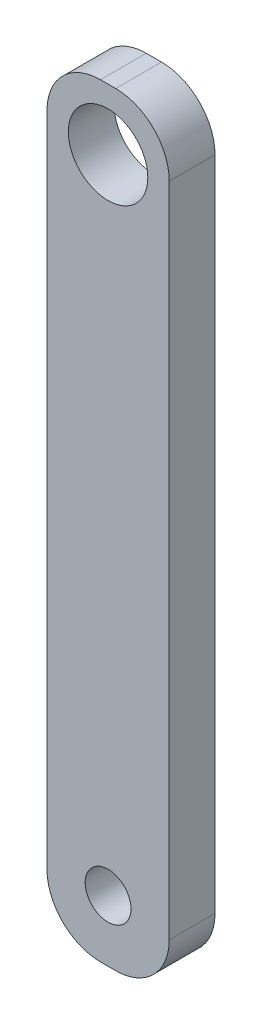
ISO-10303-21;
HEADER;
FILE_DESCRIPTION(('STEP AP214'),'2;1');
FILE_NAME('part.step','',(''),(''),'','','');
FILE_SCHEMA(('AUTOMOTIVE_DESIGN { 1 0 10303 214 1 1 1 1 }'));
ENDSEC;
DATA;
#1=APPLICATION_CONTEXT('core data for automotive mechanical design processes');
#2=APPLICATION_PROTOCOL_DEFINITION('international standard','automotive_design',2000,#1);
#3=PRODUCT_CONTEXT('',#1,'mechanical');
#4=PRODUCT('Part','Part','',(#3));
#5=PRODUCT_RELATED_PRODUCT_CATEGORY('part','',(#4));
#6=PRODUCT_DEFINITION_FORMATION('','',#4);
#7=PRODUCT_DEFINITION_CONTEXT('part definition',#1,'design');
#8=PRODUCT_DEFINITION('design','',#6,#7);
#9=PRODUCT_DEFINITION_SHAPE('','',#8);
#10=(LENGTH_UNIT() NAMED_UNIT(*) SI_UNIT(.MILLI.,.METRE.));
#11=(NAMED_UNIT(*) PLANE_ANGLE_UNIT() SI_UNIT($,.RADIAN.));
#12=(NAMED_UNIT(*) SI_UNIT($,.STERADIAN.) SOLID_ANGLE_UNIT());
#13=UNCERTAINTY_MEASURE_WITH_UNIT(LENGTH_MEASURE(1.E-05),#10,'distance_accuracy_value','');
#14=(GEOMETRIC_REPRESENTATION_CONTEXT(3) GLOBAL_UNCERTAINTY_ASSIGNED_CONTEXT((#13)) GLOBAL_UNIT_ASSIGNED_CONTEXT((#10,
#11,#12)) REPRESENTATION_CONTEXT('',''));
#15=CARTESIAN_POINT('',(0.,0.,0.));
#16=DIRECTION('',(0.,0.,1.));
#17=DIRECTION('',(1.,0.,0.));
#18=AXIS2_PLACEMENT_3D('',#15,#16,#17);
#19=CARTESIAN_POINT('',(-2.8,17.2528590218937,-2.55));
#20=DIRECTION('',(0.,1.,0.));
#21=DIRECTION('',(0.,0.,1.));
#22=AXIS2_PLACEMENT_3D('',#19,#20,#21);
#23=PLANE('',#22);
#24=DIRECTION('',(-1.,0.,0.));
#25=VECTOR('',#24,1.);
#26=CARTESIAN_POINT('',(-2.8,17.2528590218937,-0.45));
#27=LINE('',#26,#25);
#28=CARTESIAN_POINT('',(0.350000000000001,17.2528590218937,-0.45));
#29=VERTEX_POINT('',#28);
#30=CARTESIAN_POINT('',(-0.349999999999999,17.2528590218937,-0.45));
#31=VERTEX_POINT('',#30);
#32=EDGE_CURVE('E173',#29,#31,#27,.T.);
#33=ORIENTED_EDGE('',*,*,#32,.F.);
#34=DIRECTION('',(0.,0.,1.));
#35=VECTOR('',#34,1.);
#36=CARTESIAN_POINT('',(0.350000000000001,17.2528590218937,-2.55));
#37=LINE('',#36,#35);
#38=CARTESIAN_POINT('',(0.350000000000001,17.2528590218937,-2.55));
#39=VERTEX_POINT('',#38);
#40=EDGE_CURVE('E148',#29,#39,#37,.F.);
#41=ORIENTED_EDGE('',*,*,#40,.T.);
#42=DIRECTION('',(-1.,0.,0.));
#43=VECTOR('',#42,1.);
#44=CARTESIAN_POINT('',(-2.8,17.2528590218937,-2.55));
#45=LINE('',#44,#43);
#46=CARTESIAN_POINT('',(-0.349999999999999,17.2528590218937,-2.55));
#47=VERTEX_POINT('',#46);
#48=EDGE_CURVE('E129',#39,#47,#45,.T.);
#49=ORIENTED_EDGE('',*,*,#48,.T.);
#50=DIRECTION('',(0.,0.,1.));
#51=VECTOR('',#50,1.);
#52=CARTESIAN_POINT('',(-0.349999999999999,17.2528590218937,-2.55));
#53=LINE('',#52,#51);
#54=EDGE_CURVE('E145',#47,#31,#53,.T.);
#55=ORIENTED_EDGE('',*,*,#54,.T.);
#56=EDGE_LOOP('',(#33,#41,#49,#55));
#57=FACE_BOUND('',#56,.T.);
#58=ADVANCED_FACE('F42',(#57),#23,.T.);
#59=CARTESIAN_POINT('',(2.8,-17.7471409781063,-2.55));
#60=DIRECTION('',(1.,0.,0.));
#61=DIRECTION('',(0.,0.,-1.));
#62=AXIS2_PLACEMENT_3D('',#59,#60,#61);
#63=PLANE('',#62);
#64=DIRECTION('',(0.,1.,0.));
#65=VECTOR('',#64,1.);
#66=CARTESIAN_POINT('',(2.8,-17.7471409781063,-2.55));
#67=LINE('',#66,#65);
#68=CARTESIAN_POINT('',(2.8,-15.2971409781063,-2.55));
#69=VERTEX_POINT('',#68);
#70=CARTESIAN_POINT('',(2.8,14.8028590218937,-2.55));
#71=VERTEX_POINT('',#70);
#72=EDGE_CURVE('E134',#69,#71,#67,.T.);
#73=ORIENTED_EDGE('',*,*,#72,.T.);
#74=DIRECTION('',(0.,0.,1.));
#75=VECTOR('',#74,1.);
#76=CARTESIAN_POINT('',(2.8,14.8028590218937,-2.55));
#77=LINE('',#76,#75);
#78=CARTESIAN_POINT('',(2.8,14.8028590218937,-0.45));
#79=VERTEX_POINT('',#78);
#80=EDGE_CURVE('E128',#71,#79,#77,.T.);
#81=ORIENTED_EDGE('',*,*,#80,.T.);
#82=DIRECTION('',(0.,1.,0.));
#83=VECTOR('',#82,1.);
#84=CARTESIAN_POINT('',(2.8,-17.7471409781063,-0.45));
#85=LINE('',#84,#83);
#86=CARTESIAN_POINT('',(2.8,-15.2971409781063,-0.45));
#87=VERTEX_POINT('',#86);
#88=EDGE_CURVE('E112',#87,#79,#85,.T.);
#89=ORIENTED_EDGE('',*,*,#88,.F.);
#90=DIRECTION('',(0.,0.,1.));
#91=VECTOR('',#90,1.);
#92=CARTESIAN_POINT('',(2.8,-15.2971409781063,-2.55));
#93=LINE('',#92,#91);
#94=EDGE_CURVE('E125',#87,#69,#93,.F.);
#95=ORIENTED_EDGE('',*,*,#94,.T.);
#96=EDGE_LOOP('',(#73,#81,#89,#95));
#97=FACE_BOUND('',#96,.T.);
#98=ADVANCED_FACE('F124',(#97),#63,.T.);
#99=CARTESIAN_POINT('',(-2.8,-17.7471409781063,-2.55));
#100=DIRECTION('',(0.,-1.,0.));
#101=DIRECTION('',(0.,0.,-1.));
#102=AXIS2_PLACEMENT_3D('',#99,#100,#101);
#103=PLANE('',#102);
#104=DIRECTION('',(1.,0.,0.));
#105=VECTOR('',#104,1.);
#106=CARTESIAN_POINT('',(-2.8,-17.7471409781063,-2.55));
#107=LINE('',#106,#105);
#108=CARTESIAN_POINT('',(-0.349999999999999,-17.7471409781063,-2.55));
#109=VERTEX_POINT('',#108);
#110=CARTESIAN_POINT('',(0.350000000000001,-17.7471409781063,-2.55));
#111=VERTEX_POINT('',#110);
#112=EDGE_CURVE('E137',#109,#111,#107,.T.);
#113=ORIENTED_EDGE('',*,*,#112,.T.);
#114=DIRECTION('',(0.,0.,1.));
#115=VECTOR('',#114,1.);
#116=CARTESIAN_POINT('',(0.350000000000001,-17.7471409781063,-2.55));
#117=LINE('',#116,#115);
#118=CARTESIAN_POINT('',(0.350000000000001,-17.7471409781063,-0.45));
#119=VERTEX_POINT('',#118);
#120=EDGE_CURVE('E12',#111,#119,#117,.T.);
#121=ORIENTED_EDGE('',*,*,#120,.T.);
#122=DIRECTION('',(1.,0.,0.));
#123=VECTOR('',#122,1.);
#124=CARTESIAN_POINT('',(-2.8,-17.7471409781063,-0.45));
#125=LINE('',#124,#123);
#126=CARTESIAN_POINT('',(-0.349999999999999,-17.7471409781063,-0.45));
#127=VERTEX_POINT('',#126);
#128=EDGE_CURVE('E114',#127,#119,#125,.T.);
#129=ORIENTED_EDGE('',*,*,#128,.F.);
#130=DIRECTION('',(0.,0.,1.));
#131=VECTOR('',#130,1.);
#132=CARTESIAN_POINT('',(-0.349999999999999,-17.7471409781063,-2.55));
#133=LINE('',#132,#131);
#134=EDGE_CURVE('E50',#127,#109,#133,.F.);
#135=ORIENTED_EDGE('',*,*,#134,.T.);
#136=EDGE_LOOP('',(#113,#121,#129,#135));
#137=FACE_BOUND('',#136,.T.);
#138=ADVANCED_FACE('F162',(#137),#103,.T.);
#139=CARTESIAN_POINT('',(-2.8,-17.7471409781063,-2.55));
#140=DIRECTION('',(-1.,0.,0.));
#141=DIRECTION('',(0.,0.,1.));
#142=AXIS2_PLACEMENT_3D('',#139,#140,#141);
#143=PLANE('',#142);
#144=DIRECTION('',(0.,-1.,0.));
#145=VECTOR('',#144,1.);
#146=CARTESIAN_POINT('',(-2.8,-17.7471409781063,-0.45));
#147=LINE('',#146,#145);
#148=CARTESIAN_POINT('',(-2.8,14.8028590218937,-0.45));
#149=VERTEX_POINT('',#148);
#150=CARTESIAN_POINT('',(-2.8,-15.2971409781063,-0.45));
#151=VERTEX_POINT('',#150);
#152=EDGE_CURVE('E171',#149,#151,#147,.T.);
#153=ORIENTED_EDGE('',*,*,#152,.F.);
#154=DIRECTION('',(0.,0.,1.));
#155=VECTOR('',#154,1.);
#156=CARTESIAN_POINT('',(-2.8,14.8028590218937,-2.55));
#157=LINE('',#156,#155);
#158=CARTESIAN_POINT('',(-2.8,14.8028590218937,-2.55));
#159=VERTEX_POINT('',#158);
#160=EDGE_CURVE('E64',#149,#159,#157,.F.);
#161=ORIENTED_EDGE('',*,*,#160,.T.);
#162=DIRECTION('',(0.,-1.,0.));
#163=VECTOR('',#162,1.);
#164=CARTESIAN_POINT('',(-2.8,-17.7471409781063,-2.55));
#165=LINE('',#164,#163);
#166=CARTESIAN_POINT('',(-2.8,-15.2971409781063,-2.55));
#167=VERTEX_POINT('',#166);
#168=EDGE_CURVE('E166',#159,#167,#165,.T.);
#169=ORIENTED_EDGE('',*,*,#168,.T.);
#170=DIRECTION('',(0.,0.,1.));
#171=VECTOR('',#170,1.);
#172=CARTESIAN_POINT('',(-2.8,-15.2971409781063,-2.55));
#173=LINE('',#172,#171);
#174=EDGE_CURVE('E156',#167,#151,#173,.T.);
#175=ORIENTED_EDGE('',*,*,#174,.T.);
#176=EDGE_LOOP('',(#153,#161,#169,#175));
#177=FACE_BOUND('',#176,.T.);
#178=ADVANCED_FACE('F170',(#177),#143,.T.);
#179=CARTESIAN_POINT('',(0.,-0.247140978106257,-2.55));
#180=DIRECTION('',(0.,0.,1.));
#181=DIRECTION('',(1.,0.,0.));
#182=AXIS2_PLACEMENT_3D('',#179,#180,#181);
#183=PLANE('',#182);
#184=CARTESIAN_POINT('',(0.,14.4528590218937,-2.55));
#185=DIRECTION('',(0.,0.,1.));
#186=DIRECTION('',(1.,0.,0.));
#187=AXIS2_PLACEMENT_3D('',#184,#185,#186);
#188=CIRCLE('',#187,1.82);
#189=CARTESIAN_POINT('',(1.82,14.4528590218937,-2.55));
#190=VERTEX_POINT('',#189);
#191=EDGE_CURVE('E184',#190,#190,#188,.T.);
#192=ORIENTED_EDGE('',*,*,#191,.T.);
#193=EDGE_LOOP('',(#192));
#194=FACE_BOUND('',#193,.T.);
#195=CARTESIAN_POINT('',(0.,-14.9471409781063,-2.55));
#196=DIRECTION('',(0.,0.,1.));
#197=DIRECTION('',(1.,0.,0.));
#198=AXIS2_PLACEMENT_3D('',#195,#196,#197);
#199=CIRCLE('',#198,1.05);
#200=CARTESIAN_POINT('',(1.05,-14.9471409781063,-2.55));
#201=VERTEX_POINT('',#200);
#202=EDGE_CURVE('E175',#201,#201,#199,.T.);
#203=ORIENTED_EDGE('',*,*,#202,.T.);
#204=EDGE_LOOP('',(#203));
#205=FACE_BOUND('',#204,.T.);
#206=ORIENTED_EDGE('',*,*,#48,.F.);
#207=CARTESIAN_POINT('',(0.350000000000001,14.8028590218937,-2.55));
#208=DIRECTION('',(0.,0.,1.));
#209=DIRECTION('',(1.,0.,0.));
#210=AXIS2_PLACEMENT_3D('',#207,#208,#209);
#211=CIRCLE('',#210,2.45);
#212=EDGE_CURVE('E154',#39,#71,#211,.F.);
#213=ORIENTED_EDGE('',*,*,#212,.T.);
#214=ORIENTED_EDGE('',*,*,#72,.F.);
#215=CARTESIAN_POINT('',(0.350000000000001,-15.2971409781063,-2.55));
#216=DIRECTION('',(0.,0.,1.));
#217=DIRECTION('',(1.,0.,0.));
#218=AXIS2_PLACEMENT_3D('',#215,#216,#217);
#219=CIRCLE('',#218,2.45);
#220=EDGE_CURVE('E133',#69,#111,#219,.F.);
#221=ORIENTED_EDGE('',*,*,#220,.T.);
#222=ORIENTED_EDGE('',*,*,#112,.F.);
#223=CARTESIAN_POINT('',(-0.349999999999999,-15.2971409781063,-2.55));
#224=DIRECTION('',(0.,0.,1.));
#225=DIRECTION('',(1.,0.,0.));
#226=AXIS2_PLACEMENT_3D('',#223,#224,#225);
#227=CIRCLE('',#226,2.45);
#228=EDGE_CURVE('E57',#109,#167,#227,.F.);
#229=ORIENTED_EDGE('',*,*,#228,.T.);
#230=ORIENTED_EDGE('',*,*,#168,.F.);
#231=CARTESIAN_POINT('',(-0.349999999999999,14.8028590218937,-2.55));
#232=DIRECTION('',(0.,0.,1.));
#233=DIRECTION('',(1.,0.,0.));
#234=AXIS2_PLACEMENT_3D('',#231,#232,#233);
#235=CIRCLE('',#234,2.45);
#236=EDGE_CURVE('E152',#159,#47,#235,.F.);
#237=ORIENTED_EDGE('',*,*,#236,.T.);
#238=EDGE_LOOP('',(#206,#213,#214,#221,#222,#229,#230,#237));
#239=FACE_BOUND('',#238,.T.);
#240=ADVANCED_FACE('F165',(#194,#205,#239),#183,.F.);
#241=CARTESIAN_POINT('',(0.,-0.247140978106257,-0.45));
#242=DIRECTION('',(0.,0.,1.));
#243=DIRECTION('',(1.,0.,0.));
#244=AXIS2_PLACEMENT_3D('',#241,#242,#243);
#245=PLANE('',#244);
#246=CARTESIAN_POINT('',(0.,14.4528590218937,-0.45));
#247=DIRECTION('',(0.,0.,1.));
#248=DIRECTION('',(1.,0.,0.));
#249=AXIS2_PLACEMENT_3D('',#246,#247,#248);
#250=CIRCLE('',#249,1.82);
#251=CARTESIAN_POINT('',(1.82,14.4528590218937,-0.45));
#252=VERTEX_POINT('',#251);
#253=EDGE_CURVE('E187',#252,#252,#250,.T.);
#254=ORIENTED_EDGE('',*,*,#253,.F.);
#255=EDGE_LOOP('',(#254));
#256=FACE_BOUND('',#255,.T.);
#257=CARTESIAN_POINT('',(0.,-14.9471409781063,-0.45));
#258=DIRECTION('',(0.,0.,1.));
#259=DIRECTION('',(1.,0.,0.));
#260=AXIS2_PLACEMENT_3D('',#257,#258,#259);
#261=CIRCLE('',#260,1.05);
#262=CARTESIAN_POINT('',(1.05,-14.9471409781063,-0.45));
#263=VERTEX_POINT('',#262);
#264=EDGE_CURVE('E181',#263,#263,#261,.T.);
#265=ORIENTED_EDGE('',*,*,#264,.F.);
#266=EDGE_LOOP('',(#265));
#267=FACE_BOUND('',#266,.T.);
#268=ORIENTED_EDGE('',*,*,#88,.T.);
#269=CARTESIAN_POINT('',(0.350000000000001,14.8028590218937,-0.45));
#270=DIRECTION('',(0.,0.,1.));
#271=DIRECTION('',(1.,0.,0.));
#272=AXIS2_PLACEMENT_3D('',#269,#270,#271);
#273=CIRCLE('',#272,2.45);
#274=EDGE_CURVE('E143',#79,#29,#273,.T.);
#275=ORIENTED_EDGE('',*,*,#274,.T.);
#276=ORIENTED_EDGE('',*,*,#32,.T.);
#277=CARTESIAN_POINT('',(-0.349999999999999,14.8028590218937,-0.45));
#278=DIRECTION('',(0.,0.,1.));
#279=DIRECTION('',(1.,0.,0.));
#280=AXIS2_PLACEMENT_3D('',#277,#278,#279);
#281=CIRCLE('',#280,2.45);
#282=EDGE_CURVE('E118',#31,#149,#281,.T.);
#283=ORIENTED_EDGE('',*,*,#282,.T.);
#284=ORIENTED_EDGE('',*,*,#152,.T.);
#285=CARTESIAN_POINT('',(-0.349999999999999,-15.2971409781063,-0.45));
#286=DIRECTION('',(0.,0.,1.));
#287=DIRECTION('',(1.,0.,0.));
#288=AXIS2_PLACEMENT_3D('',#285,#286,#287);
#289=CIRCLE('',#288,2.45);
#290=EDGE_CURVE('E119',#151,#127,#289,.T.);
#291=ORIENTED_EDGE('',*,*,#290,.T.);
#292=ORIENTED_EDGE('',*,*,#128,.T.);
#293=CARTESIAN_POINT('',(0.350000000000001,-15.2971409781063,-0.45));
#294=DIRECTION('',(0.,0.,1.));
#295=DIRECTION('',(1.,0.,0.));
#296=AXIS2_PLACEMENT_3D('',#293,#294,#295);
#297=CIRCLE('',#296,2.45);
#298=EDGE_CURVE('E109',#119,#87,#297,.T.);
#299=ORIENTED_EDGE('',*,*,#298,.T.);
#300=EDGE_LOOP('',(#268,#275,#276,#283,#284,#291,#292,#299));
#301=FACE_BOUND('',#300,.T.);
#302=ADVANCED_FACE('F111',(#256,#267,#301),#245,.T.);
#303=CARTESIAN_POINT('',(0.,-14.9471409781063,-2.55));
#304=DIRECTION('',(0.,0.,1.));
#305=DIRECTION('',(1.,0.,0.));
#306=AXIS2_PLACEMENT_3D('',#303,#304,#305);
#307=CYLINDRICAL_SURFACE('',#306,1.05);
#308=ORIENTED_EDGE('',*,*,#202,.F.);
#309=EDGE_LOOP('',(#308));
#310=FACE_BOUND('',#309,.T.);
#311=ORIENTED_EDGE('',*,*,#264,.T.);
#312=EDGE_LOOP('',(#311));
#313=FACE_BOUND('',#312,.T.);
#314=ADVANCED_FACE('F199',(#310,#313),#307,.F.);
#315=CARTESIAN_POINT('',(0.,14.4528590218937,-2.55));
#316=DIRECTION('',(0.,0.,1.));
#317=DIRECTION('',(1.,0.,0.));
#318=AXIS2_PLACEMENT_3D('',#315,#316,#317);
#319=CYLINDRICAL_SURFACE('',#318,1.82);
#320=ORIENTED_EDGE('',*,*,#191,.F.);
#321=EDGE_LOOP('',(#320));
#322=FACE_BOUND('',#321,.T.);
#323=ORIENTED_EDGE('',*,*,#253,.T.);
#324=EDGE_LOOP('',(#323));
#325=FACE_BOUND('',#324,.T.);
#326=ADVANCED_FACE('F195',(#322,#325),#319,.F.);
#327=CARTESIAN_POINT('',(0.350000000000001,14.8028590218937,-2.55));
#328=DIRECTION('',(0.,0.,1.));
#329=DIRECTION('',(1.,0.,0.));
#330=AXIS2_PLACEMENT_3D('',#327,#328,#329);
#331=CYLINDRICAL_SURFACE('',#330,2.45);
#332=ORIENTED_EDGE('',*,*,#212,.F.);
#333=ORIENTED_EDGE('',*,*,#40,.F.);
#334=ORIENTED_EDGE('',*,*,#274,.F.);
#335=ORIENTED_EDGE('',*,*,#80,.F.);
#336=EDGE_LOOP('',(#332,#333,#334,#335));
#337=FACE_BOUND('',#336,.T.);
#338=ADVANCED_FACE('F198',(#337),#331,.T.);
#339=CARTESIAN_POINT('',(-0.349999999999999,14.8028590218937,-2.55));
#340=DIRECTION('',(0.,0.,1.));
#341=DIRECTION('',(1.,0.,0.));
#342=AXIS2_PLACEMENT_3D('',#339,#340,#341);
#343=CYLINDRICAL_SURFACE('',#342,2.45);
#344=ORIENTED_EDGE('',*,*,#236,.F.);
#345=ORIENTED_EDGE('',*,*,#160,.F.);
#346=ORIENTED_EDGE('',*,*,#282,.F.);
#347=ORIENTED_EDGE('',*,*,#54,.F.);
#348=EDGE_LOOP('',(#344,#345,#346,#347));
#349=FACE_BOUND('',#348,.T.);
#350=ADVANCED_FACE('F228',(#349),#343,.T.);
#351=CARTESIAN_POINT('',(0.350000000000001,-15.2971409781063,-2.55));
#352=DIRECTION('',(0.,0.,1.));
#353=DIRECTION('',(1.,0.,0.));
#354=AXIS2_PLACEMENT_3D('',#351,#352,#353);
#355=CYLINDRICAL_SURFACE('',#354,2.45);
#356=ORIENTED_EDGE('',*,*,#220,.F.);
#357=ORIENTED_EDGE('',*,*,#94,.F.);
#358=ORIENTED_EDGE('',*,*,#298,.F.);
#359=ORIENTED_EDGE('',*,*,#120,.F.);
#360=EDGE_LOOP('',(#356,#357,#358,#359));
#361=FACE_BOUND('',#360,.T.);
#362=ADVANCED_FACE('F132',(#361),#355,.T.);
#363=CARTESIAN_POINT('',(-0.349999999999999,-15.2971409781063,-2.55));
#364=DIRECTION('',(0.,0.,1.));
#365=DIRECTION('',(1.,0.,0.));
#366=AXIS2_PLACEMENT_3D('',#363,#364,#365);
#367=CYLINDRICAL_SURFACE('',#366,2.45);
#368=ORIENTED_EDGE('',*,*,#228,.F.);
#369=ORIENTED_EDGE('',*,*,#134,.F.);
#370=ORIENTED_EDGE('',*,*,#290,.F.);
#371=ORIENTED_EDGE('',*,*,#174,.F.);
#372=EDGE_LOOP('',(#368,#369,#370,#371));
#373=FACE_BOUND('',#372,.T.);
#374=ADVANCED_FACE('F44',(#373),#367,.T.);
#375=CLOSED_SHELL('',(#58,#98,#138,#178,#240,#302,#314,#326,#338,#350,#362,#374));
#376=MANIFOLD_SOLID_BREP('B2',#375);
#377=ADVANCED_BREP_SHAPE_REPRESENTATION('',(#18,#376),#14);
#378=SHAPE_DEFINITION_REPRESENTATION(#9,#377);
ENDSEC;
END-ISO-10303-21;
